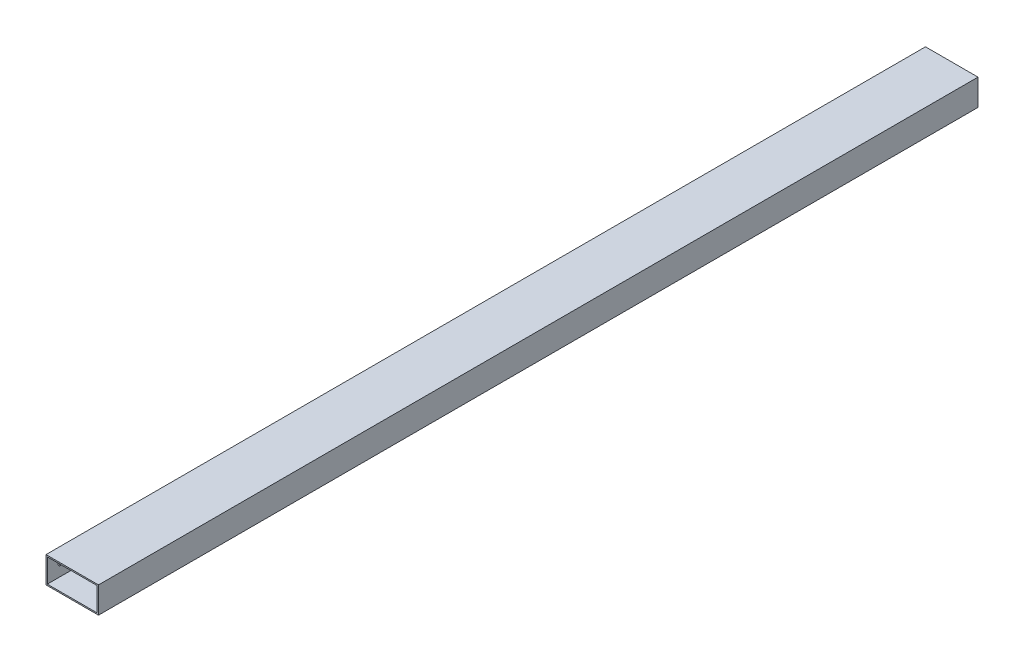
ISO-10303-21;
HEADER;
FILE_DESCRIPTION(('STEP AP214'),'2;1');
FILE_NAME('part.step','',(''),(''),'','','');
FILE_SCHEMA(('AUTOMOTIVE_DESIGN { 1 0 10303 214 1 1 1 1 }'));
ENDSEC;
DATA;
#1=APPLICATION_CONTEXT('core data for automotive mechanical design processes');
#2=APPLICATION_PROTOCOL_DEFINITION('international standard','automotive_design',2000,#1);
#3=PRODUCT_CONTEXT('',#1,'mechanical');
#4=PRODUCT('Part','Part','',(#3));
#5=PRODUCT_RELATED_PRODUCT_CATEGORY('part','',(#4));
#6=PRODUCT_DEFINITION_FORMATION('','',#4);
#7=PRODUCT_DEFINITION_CONTEXT('part definition',#1,'design');
#8=PRODUCT_DEFINITION('design','',#6,#7);
#9=PRODUCT_DEFINITION_SHAPE('','',#8);
#10=(LENGTH_UNIT() NAMED_UNIT(*) SI_UNIT(.MILLI.,.METRE.));
#11=(NAMED_UNIT(*) PLANE_ANGLE_UNIT() SI_UNIT($,.RADIAN.));
#12=(NAMED_UNIT(*) SI_UNIT($,.STERADIAN.) SOLID_ANGLE_UNIT());
#13=UNCERTAINTY_MEASURE_WITH_UNIT(LENGTH_MEASURE(1.E-05),#10,'distance_accuracy_value','');
#14=(GEOMETRIC_REPRESENTATION_CONTEXT(3) GLOBAL_UNCERTAINTY_ASSIGNED_CONTEXT((#13)) GLOBAL_UNIT_ASSIGNED_CONTEXT((#10,
#11,#12)) REPRESENTATION_CONTEXT('',''));
#15=CARTESIAN_POINT('',(0.,0.,0.));
#16=DIRECTION('',(0.,0.,1.));
#17=DIRECTION('',(1.,0.,0.));
#18=AXIS2_PLACEMENT_3D('',#15,#16,#17);
#19=CARTESIAN_POINT('',(0.,0.,670.));
#20=DIRECTION('',(0.,0.,1.));
#21=DIRECTION('',(1.,0.,0.));
#22=AXIS2_PLACEMENT_3D('',#19,#20,#21);
#23=PLANE('',#22);
#24=DIRECTION('',(0.,-1.,0.));
#25=VECTOR('',#24,1.);
#26=CARTESIAN_POINT('',(0.,0.,670.));
#27=LINE('',#26,#25);
#28=CARTESIAN_POINT('',(0.,0.,670.));
#29=VERTEX_POINT('',#28);
#30=CARTESIAN_POINT('',(0.,-20.,670.));
#31=VERTEX_POINT('',#30);
#32=EDGE_CURVE('E169',#29,#31,#27,.T.);
#33=ORIENTED_EDGE('',*,*,#32,.T.);
#34=DIRECTION('',(1.,0.,0.));
#35=VECTOR('',#34,1.);
#36=CARTESIAN_POINT('',(0.,-20.,670.));
#37=LINE('',#36,#35);
#38=CARTESIAN_POINT('',(40.,-20.,670.));
#39=VERTEX_POINT('',#38);
#40=EDGE_CURVE('E172',#31,#39,#37,.T.);
#41=ORIENTED_EDGE('',*,*,#40,.T.);
#42=DIRECTION('',(0.,1.,0.));
#43=VECTOR('',#42,1.);
#44=CARTESIAN_POINT('',(40.,0.,670.));
#45=LINE('',#44,#43);
#46=CARTESIAN_POINT('',(40.,0.,670.));
#47=VERTEX_POINT('',#46);
#48=EDGE_CURVE('E175',#39,#47,#45,.T.);
#49=ORIENTED_EDGE('',*,*,#48,.T.);
#50=DIRECTION('',(-1.,0.,0.));
#51=VECTOR('',#50,1.);
#52=CARTESIAN_POINT('',(0.,0.,670.));
#53=LINE('',#52,#51);
#54=EDGE_CURVE('E177',#47,#29,#53,.T.);
#55=ORIENTED_EDGE('',*,*,#54,.T.);
#56=EDGE_LOOP('',(#33,#41,#49,#55));
#57=FACE_BOUND('',#56,.T.);
#58=DIRECTION('',(1.,0.,0.));
#59=VECTOR('',#58,1.);
#60=CARTESIAN_POINT('',(0.,-19.,670.));
#61=LINE('',#60,#59);
#62=CARTESIAN_POINT('',(1.,-19.,670.));
#63=VERTEX_POINT('',#62);
#64=CARTESIAN_POINT('',(39.,-19.,670.));
#65=VERTEX_POINT('',#64);
#66=EDGE_CURVE('E139',#63,#65,#61,.T.);
#67=ORIENTED_EDGE('',*,*,#66,.F.);
#68=DIRECTION('',(0.,-1.,0.));
#69=VECTOR('',#68,1.);
#70=CARTESIAN_POINT('',(1.,0.,670.));
#71=LINE('',#70,#69);
#72=CARTESIAN_POINT('',(1.,-1.,670.));
#73=VERTEX_POINT('',#72);
#74=EDGE_CURVE('E131',#73,#63,#71,.T.);
#75=ORIENTED_EDGE('',*,*,#74,.F.);
#76=DIRECTION('',(-1.,0.,0.));
#77=VECTOR('',#76,1.);
#78=CARTESIAN_POINT('',(0.,-1.,670.));
#79=LINE('',#78,#77);
#80=CARTESIAN_POINT('',(39.,-1.,670.));
#81=VERTEX_POINT('',#80);
#82=EDGE_CURVE('E153',#81,#73,#79,.T.);
#83=ORIENTED_EDGE('',*,*,#82,.F.);
#84=DIRECTION('',(0.,1.,0.));
#85=VECTOR('',#84,1.);
#86=CARTESIAN_POINT('',(39.,0.,670.));
#87=LINE('',#86,#85);
#88=EDGE_CURVE('E151',#65,#81,#87,.T.);
#89=ORIENTED_EDGE('',*,*,#88,.F.);
#90=EDGE_LOOP('',(#67,#75,#83,#89));
#91=FACE_BOUND('',#90,.T.);
#92=ADVANCED_FACE('F64',(#57,#91),#23,.T.);
#93=CARTESIAN_POINT('',(0.,0.,0.));
#94=DIRECTION('',(0.,0.,1.));
#95=DIRECTION('',(1.,0.,0.));
#96=AXIS2_PLACEMENT_3D('',#93,#94,#95);
#97=PLANE('',#96);
#98=DIRECTION('',(0.,-1.,0.));
#99=VECTOR('',#98,1.);
#100=CARTESIAN_POINT('',(0.,0.,0.));
#101=LINE('',#100,#99);
#102=CARTESIAN_POINT('',(0.,0.,0.));
#103=VERTEX_POINT('',#102);
#104=CARTESIAN_POINT('',(0.,-20.,0.));
#105=VERTEX_POINT('',#104);
#106=EDGE_CURVE('E147',#103,#105,#101,.T.);
#107=ORIENTED_EDGE('',*,*,#106,.F.);
#108=DIRECTION('',(-1.,0.,0.));
#109=VECTOR('',#108,1.);
#110=CARTESIAN_POINT('',(0.,0.,0.));
#111=LINE('',#110,#109);
#112=CARTESIAN_POINT('',(40.,0.,0.));
#113=VERTEX_POINT('',#112);
#114=EDGE_CURVE('E173',#113,#103,#111,.T.);
#115=ORIENTED_EDGE('',*,*,#114,.F.);
#116=DIRECTION('',(0.,1.,0.));
#117=VECTOR('',#116,1.);
#118=CARTESIAN_POINT('',(40.,0.,0.));
#119=LINE('',#118,#117);
#120=CARTESIAN_POINT('',(40.,-20.,0.));
#121=VERTEX_POINT('',#120);
#122=EDGE_CURVE('E184',#121,#113,#119,.T.);
#123=ORIENTED_EDGE('',*,*,#122,.F.);
#124=DIRECTION('',(1.,0.,0.));
#125=VECTOR('',#124,1.);
#126=CARTESIAN_POINT('',(0.,-20.,0.));
#127=LINE('',#126,#125);
#128=EDGE_CURVE('E182',#105,#121,#127,.T.);
#129=ORIENTED_EDGE('',*,*,#128,.F.);
#130=EDGE_LOOP('',(#107,#115,#123,#129));
#131=FACE_BOUND('',#130,.T.);
#132=DIRECTION('',(0.,-1.,0.));
#133=VECTOR('',#132,1.);
#134=CARTESIAN_POINT('',(1.,0.,0.));
#135=LINE('',#134,#133);
#136=CARTESIAN_POINT('',(1.,-1.,0.));
#137=VERTEX_POINT('',#136);
#138=CARTESIAN_POINT('',(1.,-19.,0.));
#139=VERTEX_POINT('',#138);
#140=EDGE_CURVE('E89',#137,#139,#135,.T.);
#141=ORIENTED_EDGE('',*,*,#140,.T.);
#142=DIRECTION('',(1.,0.,0.));
#143=VECTOR('',#142,1.);
#144=CARTESIAN_POINT('',(0.,-19.,0.));
#145=LINE('',#144,#143);
#146=CARTESIAN_POINT('',(39.,-19.,0.));
#147=VERTEX_POINT('',#146);
#148=EDGE_CURVE('E146',#139,#147,#145,.T.);
#149=ORIENTED_EDGE('',*,*,#148,.T.);
#150=DIRECTION('',(0.,1.,0.));
#151=VECTOR('',#150,1.);
#152=CARTESIAN_POINT('',(39.,0.,0.));
#153=LINE('',#152,#151);
#154=CARTESIAN_POINT('',(39.,-1.,0.));
#155=VERTEX_POINT('',#154);
#156=EDGE_CURVE('E161',#147,#155,#153,.T.);
#157=ORIENTED_EDGE('',*,*,#156,.T.);
#158=DIRECTION('',(-1.,0.,0.));
#159=VECTOR('',#158,1.);
#160=CARTESIAN_POINT('',(0.,-1.,0.));
#161=LINE('',#160,#159);
#162=EDGE_CURVE('E140',#155,#137,#161,.T.);
#163=ORIENTED_EDGE('',*,*,#162,.T.);
#164=EDGE_LOOP('',(#141,#149,#157,#163));
#165=FACE_BOUND('',#164,.T.);
#166=ADVANCED_FACE('F223',(#131,#165),#97,.F.);
#167=CARTESIAN_POINT('',(0.,0.,670.));
#168=DIRECTION('',(1.,0.,0.));
#169=DIRECTION('',(0.,0.,-1.));
#170=AXIS2_PLACEMENT_3D('',#167,#168,#169);
#171=PLANE('',#170);
#172=CARTESIAN_POINT('',(0.,-7.5,100.));
#173=DIRECTION('',(-1.,0.,0.));
#174=DIRECTION('',(0.,0.,1.));
#175=AXIS2_PLACEMENT_3D('',#172,#173,#174);
#176=CIRCLE('',#175,1.65);
#177=CARTESIAN_POINT('',(0.,-7.5,101.65));
#178=VERTEX_POINT('',#177);
#179=EDGE_CURVE('E201',#178,#178,#176,.T.);
#180=ORIENTED_EDGE('',*,*,#179,.F.);
#181=EDGE_LOOP('',(#180));
#182=FACE_BOUND('',#181,.T.);
#183=CARTESIAN_POINT('',(0.,-7.5,370.));
#184=DIRECTION('',(-1.,0.,0.));
#185=DIRECTION('',(0.,0.,1.));
#186=AXIS2_PLACEMENT_3D('',#183,#184,#185);
#187=CIRCLE('',#186,1.65000000000004);
#188=CARTESIAN_POINT('',(0.,-7.5,371.65));
#189=VERTEX_POINT('',#188);
#190=EDGE_CURVE('E207',#189,#189,#187,.T.);
#191=ORIENTED_EDGE('',*,*,#190,.F.);
#192=EDGE_LOOP('',(#191));
#193=FACE_BOUND('',#192,.T.);
#194=CARTESIAN_POINT('',(0.,-10.,659.996387591484));
#195=DIRECTION('',(-1.,0.,0.));
#196=DIRECTION('',(0.,0.,1.));
#197=AXIS2_PLACEMENT_3D('',#194,#195,#196);
#198=CIRCLE('',#197,1.7500000000001);
#199=CARTESIAN_POINT('',(0.,-10.,661.746387591484));
#200=VERTEX_POINT('',#199);
#201=EDGE_CURVE('E197',#200,#200,#198,.T.);
#202=ORIENTED_EDGE('',*,*,#201,.F.);
#203=EDGE_LOOP('',(#202));
#204=FACE_BOUND('',#203,.T.);
#205=CARTESIAN_POINT('',(0.,-10.0000000016865,9.99999999971425));
#206=DIRECTION('',(-1.,0.,0.));
#207=DIRECTION('',(0.,0.,1.));
#208=AXIS2_PLACEMENT_3D('',#205,#206,#207);
#209=CIRCLE('',#208,1.75000000027376);
#210=CARTESIAN_POINT('',(0.,-10.0000000016865,11.749999999988));
#211=VERTEX_POINT('',#210);
#212=EDGE_CURVE('E205',#211,#211,#209,.T.);
#213=ORIENTED_EDGE('',*,*,#212,.F.);
#214=EDGE_LOOP('',(#213));
#215=FACE_BOUND('',#214,.T.);
#216=ORIENTED_EDGE('',*,*,#106,.T.);
#217=DIRECTION('',(0.,0.,-1.));
#218=VECTOR('',#217,1.);
#219=CARTESIAN_POINT('',(0.,-20.,670.));
#220=LINE('',#219,#218);
#221=EDGE_CURVE('E12',#31,#105,#220,.T.);
#222=ORIENTED_EDGE('',*,*,#221,.F.);
#223=ORIENTED_EDGE('',*,*,#32,.F.);
#224=DIRECTION('',(0.,0.,-1.));
#225=VECTOR('',#224,1.);
#226=CARTESIAN_POINT('',(0.,0.,670.));
#227=LINE('',#226,#225);
#228=EDGE_CURVE('E179',#29,#103,#227,.T.);
#229=ORIENTED_EDGE('',*,*,#228,.T.);
#230=EDGE_LOOP('',(#216,#222,#223,#229));
#231=FACE_BOUND('',#230,.T.);
#232=ADVANCED_FACE('F66',(#182,#193,#204,#215,#231),#171,.F.);
#233=CARTESIAN_POINT('',(0.,-20.,670.));
#234=DIRECTION('',(0.,1.,0.));
#235=DIRECTION('',(0.,0.,1.));
#236=AXIS2_PLACEMENT_3D('',#233,#234,#235);
#237=PLANE('',#236);
#238=ORIENTED_EDGE('',*,*,#128,.T.);
#239=DIRECTION('',(0.,0.,-1.));
#240=VECTOR('',#239,1.);
#241=CARTESIAN_POINT('',(40.,-20.,670.));
#242=LINE('',#241,#240);
#243=EDGE_CURVE('E73',#39,#121,#242,.T.);
#244=ORIENTED_EDGE('',*,*,#243,.F.);
#245=ORIENTED_EDGE('',*,*,#40,.F.);
#246=ORIENTED_EDGE('',*,*,#221,.T.);
#247=EDGE_LOOP('',(#238,#244,#245,#246));
#248=FACE_BOUND('',#247,.T.);
#249=ADVANCED_FACE('F222',(#248),#237,.F.);
#250=CARTESIAN_POINT('',(40.,0.,670.));
#251=DIRECTION('',(-1.,0.,0.));
#252=DIRECTION('',(0.,0.,1.));
#253=AXIS2_PLACEMENT_3D('',#250,#251,#252);
#254=PLANE('',#253);
#255=ORIENTED_EDGE('',*,*,#122,.T.);
#256=DIRECTION('',(0.,0.,-1.));
#257=VECTOR('',#256,1.);
#258=CARTESIAN_POINT('',(40.,0.,670.));
#259=LINE('',#258,#257);
#260=EDGE_CURVE('E189',#47,#113,#259,.T.);
#261=ORIENTED_EDGE('',*,*,#260,.F.);
#262=ORIENTED_EDGE('',*,*,#48,.F.);
#263=ORIENTED_EDGE('',*,*,#243,.T.);
#264=EDGE_LOOP('',(#255,#261,#262,#263));
#265=FACE_BOUND('',#264,.T.);
#266=ADVANCED_FACE('F242',(#265),#254,.F.);
#267=CARTESIAN_POINT('',(0.,0.,670.));
#268=DIRECTION('',(0.,-1.,0.));
#269=DIRECTION('',(0.,0.,-1.));
#270=AXIS2_PLACEMENT_3D('',#267,#268,#269);
#271=PLANE('',#270);
#272=ORIENTED_EDGE('',*,*,#114,.T.);
#273=ORIENTED_EDGE('',*,*,#228,.F.);
#274=ORIENTED_EDGE('',*,*,#54,.F.);
#275=ORIENTED_EDGE('',*,*,#260,.T.);
#276=EDGE_LOOP('',(#272,#273,#274,#275));
#277=FACE_BOUND('',#276,.T.);
#278=ADVANCED_FACE('F240',(#277),#271,.F.);
#279=CARTESIAN_POINT('',(1.,0.,670.));
#280=DIRECTION('',(1.,0.,0.));
#281=DIRECTION('',(0.,0.,-1.));
#282=AXIS2_PLACEMENT_3D('',#279,#280,#281);
#283=PLANE('',#282);
#284=CARTESIAN_POINT('',(1.,-7.5,100.));
#285=DIRECTION('',(1.,0.,0.));
#286=DIRECTION('',(0.,0.,-1.));
#287=AXIS2_PLACEMENT_3D('',#284,#285,#286);
#288=CIRCLE('',#287,1.65);
#289=CARTESIAN_POINT('',(1.,-7.5,98.35));
#290=VERTEX_POINT('',#289);
#291=EDGE_CURVE('E68',#290,#290,#288,.T.);
#292=ORIENTED_EDGE('',*,*,#291,.F.);
#293=EDGE_LOOP('',(#292));
#294=FACE_BOUND('',#293,.T.);
#295=CARTESIAN_POINT('',(1.,-7.5,370.));
#296=DIRECTION('',(1.,0.,0.));
#297=DIRECTION('',(0.,0.,-1.));
#298=AXIS2_PLACEMENT_3D('',#295,#296,#297);
#299=CIRCLE('',#298,1.65000000000004);
#300=CARTESIAN_POINT('',(1.,-7.5,368.35));
#301=VERTEX_POINT('',#300);
#302=EDGE_CURVE('E199',#301,#301,#299,.T.);
#303=ORIENTED_EDGE('',*,*,#302,.F.);
#304=EDGE_LOOP('',(#303));
#305=FACE_BOUND('',#304,.T.);
#306=CARTESIAN_POINT('',(1.,-10.,659.996387591484));
#307=DIRECTION('',(1.,0.,0.));
#308=DIRECTION('',(0.,0.,-1.));
#309=AXIS2_PLACEMENT_3D('',#306,#307,#308);
#310=CIRCLE('',#309,1.7500000000001);
#311=CARTESIAN_POINT('',(1.,-10.,658.246387591484));
#312=VERTEX_POINT('',#311);
#313=EDGE_CURVE('E159',#312,#312,#310,.T.);
#314=ORIENTED_EDGE('',*,*,#313,.F.);
#315=EDGE_LOOP('',(#314));
#316=FACE_BOUND('',#315,.T.);
#317=CARTESIAN_POINT('',(1.,-10.0000000016865,9.99999999971425));
#318=DIRECTION('',(1.,0.,0.));
#319=DIRECTION('',(0.,0.,-1.));
#320=AXIS2_PLACEMENT_3D('',#317,#318,#319);
#321=CIRCLE('',#320,1.75000000027376);
#322=CARTESIAN_POINT('',(1.,-10.0000000016865,8.24999999944049));
#323=VERTEX_POINT('',#322);
#324=EDGE_CURVE('E194',#323,#323,#321,.T.);
#325=ORIENTED_EDGE('',*,*,#324,.F.);
#326=EDGE_LOOP('',(#325));
#327=FACE_BOUND('',#326,.T.);
#328=ORIENTED_EDGE('',*,*,#140,.F.);
#329=DIRECTION('',(0.,0.,-1.));
#330=VECTOR('',#329,1.);
#331=CARTESIAN_POINT('',(1.,-1.,670.));
#332=LINE('',#331,#330);
#333=EDGE_CURVE('E135',#73,#137,#332,.T.);
#334=ORIENTED_EDGE('',*,*,#333,.F.);
#335=ORIENTED_EDGE('',*,*,#74,.T.);
#336=DIRECTION('',(0.,0.,-1.));
#337=VECTOR('',#336,1.);
#338=CARTESIAN_POINT('',(1.,-19.,670.));
#339=LINE('',#338,#337);
#340=EDGE_CURVE('E134',#63,#139,#339,.T.);
#341=ORIENTED_EDGE('',*,*,#340,.T.);
#342=EDGE_LOOP('',(#328,#334,#335,#341));
#343=FACE_BOUND('',#342,.T.);
#344=ADVANCED_FACE('F133',(#294,#305,#316,#327,#343),#283,.T.);
#345=CARTESIAN_POINT('',(0.,-19.,670.));
#346=DIRECTION('',(0.,1.,0.));
#347=DIRECTION('',(0.,0.,1.));
#348=AXIS2_PLACEMENT_3D('',#345,#346,#347);
#349=PLANE('',#348);
#350=ORIENTED_EDGE('',*,*,#148,.F.);
#351=ORIENTED_EDGE('',*,*,#340,.F.);
#352=ORIENTED_EDGE('',*,*,#66,.T.);
#353=DIRECTION('',(0.,0.,-1.));
#354=VECTOR('',#353,1.);
#355=CARTESIAN_POINT('',(39.,-19.,670.));
#356=LINE('',#355,#354);
#357=EDGE_CURVE('E148',#65,#147,#356,.T.);
#358=ORIENTED_EDGE('',*,*,#357,.T.);
#359=EDGE_LOOP('',(#350,#351,#352,#358));
#360=FACE_BOUND('',#359,.T.);
#361=ADVANCED_FACE('F143',(#360),#349,.T.);
#362=CARTESIAN_POINT('',(39.,0.,670.));
#363=DIRECTION('',(-1.,0.,0.));
#364=DIRECTION('',(0.,0.,1.));
#365=AXIS2_PLACEMENT_3D('',#362,#363,#364);
#366=PLANE('',#365);
#367=ORIENTED_EDGE('',*,*,#156,.F.);
#368=ORIENTED_EDGE('',*,*,#357,.F.);
#369=ORIENTED_EDGE('',*,*,#88,.T.);
#370=DIRECTION('',(0.,0.,-1.));
#371=VECTOR('',#370,1.);
#372=CARTESIAN_POINT('',(39.,-1.,670.));
#373=LINE('',#372,#371);
#374=EDGE_CURVE('E81',#81,#155,#373,.T.);
#375=ORIENTED_EDGE('',*,*,#374,.T.);
#376=EDGE_LOOP('',(#367,#368,#369,#375));
#377=FACE_BOUND('',#376,.T.);
#378=ADVANCED_FACE('F262',(#377),#366,.T.);
#379=CARTESIAN_POINT('',(0.,-1.,670.));
#380=DIRECTION('',(0.,-1.,0.));
#381=DIRECTION('',(0.,0.,-1.));
#382=AXIS2_PLACEMENT_3D('',#379,#380,#381);
#383=PLANE('',#382);
#384=ORIENTED_EDGE('',*,*,#162,.F.);
#385=ORIENTED_EDGE('',*,*,#374,.F.);
#386=ORIENTED_EDGE('',*,*,#82,.T.);
#387=ORIENTED_EDGE('',*,*,#333,.T.);
#388=EDGE_LOOP('',(#384,#385,#386,#387));
#389=FACE_BOUND('',#388,.T.);
#390=ADVANCED_FACE('F265',(#389),#383,.T.);
#391=CARTESIAN_POINT('',(1.5,-10.0000000016865,9.99999999971425));
#392=DIRECTION('',(-1.,0.,0.));
#393=DIRECTION('',(0.,0.,1.));
#394=AXIS2_PLACEMENT_3D('',#391,#392,#393);
#395=CYLINDRICAL_SURFACE('',#394,1.75000000027376);
#396=ORIENTED_EDGE('',*,*,#324,.T.);
#397=EDGE_LOOP('',(#396));
#398=FACE_BOUND('',#397,.T.);
#399=ORIENTED_EDGE('',*,*,#212,.T.);
#400=EDGE_LOOP('',(#399));
#401=FACE_BOUND('',#400,.T.);
#402=ADVANCED_FACE('F218',(#398,#401),#395,.F.);
#403=CARTESIAN_POINT('',(1.5,-10.,659.996387591484));
#404=DIRECTION('',(-1.,0.,0.));
#405=DIRECTION('',(0.,0.,1.));
#406=AXIS2_PLACEMENT_3D('',#403,#404,#405);
#407=CYLINDRICAL_SURFACE('',#406,1.7500000000001);
#408=ORIENTED_EDGE('',*,*,#313,.T.);
#409=EDGE_LOOP('',(#408));
#410=FACE_BOUND('',#409,.T.);
#411=ORIENTED_EDGE('',*,*,#201,.T.);
#412=EDGE_LOOP('',(#411));
#413=FACE_BOUND('',#412,.T.);
#414=ADVANCED_FACE('F271',(#410,#413),#407,.F.);
#415=CARTESIAN_POINT('',(5.,-7.5,370.));
#416=DIRECTION('',(-1.,0.,0.));
#417=DIRECTION('',(0.,0.,1.));
#418=AXIS2_PLACEMENT_3D('',#415,#416,#417);
#419=CYLINDRICAL_SURFACE('',#418,1.65000000000004);
#420=ORIENTED_EDGE('',*,*,#302,.T.);
#421=EDGE_LOOP('',(#420));
#422=FACE_BOUND('',#421,.T.);
#423=ORIENTED_EDGE('',*,*,#190,.T.);
#424=EDGE_LOOP('',(#423));
#425=FACE_BOUND('',#424,.T.);
#426=ADVANCED_FACE('F275',(#422,#425),#419,.F.);
#427=CARTESIAN_POINT('',(5.,-7.5,100.));
#428=DIRECTION('',(-1.,0.,0.));
#429=DIRECTION('',(0.,0.,1.));
#430=AXIS2_PLACEMENT_3D('',#427,#428,#429);
#431=CYLINDRICAL_SURFACE('',#430,1.65);
#432=ORIENTED_EDGE('',*,*,#291,.T.);
#433=EDGE_LOOP('',(#432));
#434=FACE_BOUND('',#433,.T.);
#435=ORIENTED_EDGE('',*,*,#179,.T.);
#436=EDGE_LOOP('',(#435));
#437=FACE_BOUND('',#436,.T.);
#438=ADVANCED_FACE('F279',(#434,#437),#431,.F.);
#439=CLOSED_SHELL('',(#92,#166,#232,#249,#266,#278,#344,#361,#378,#390,#402,#414,#426,#438));
#440=MANIFOLD_SOLID_BREP('B2',#439);
#441=ADVANCED_BREP_SHAPE_REPRESENTATION('',(#18,#440),#14);
#442=SHAPE_DEFINITION_REPRESENTATION(#9,#441);
ENDSEC;
END-ISO-10303-21;
